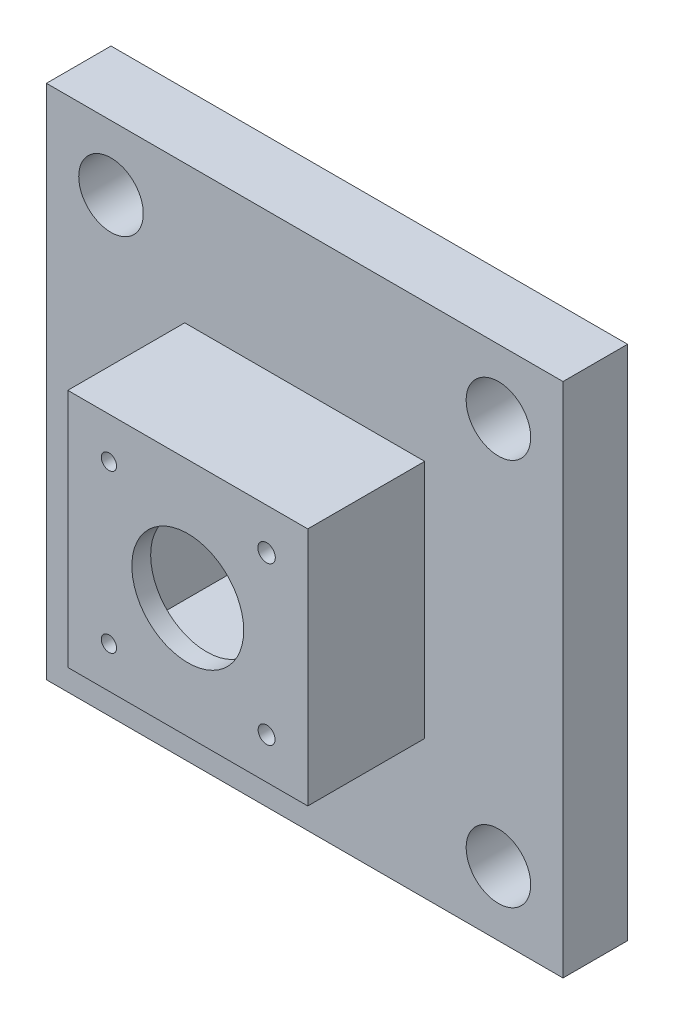
ISO-10303-21;
HEADER;
FILE_DESCRIPTION(('STEP AP214'),'2;1');
FILE_NAME('part.step','',(''),(''),'','','');
FILE_SCHEMA(('AUTOMOTIVE_DESIGN { 1 0 10303 214 1 1 1 1 }'));
ENDSEC;
DATA;
#1=APPLICATION_CONTEXT('core data for automotive mechanical design processes');
#2=APPLICATION_PROTOCOL_DEFINITION('international standard','automotive_design',2000,#1);
#3=PRODUCT_CONTEXT('',#1,'mechanical');
#4=PRODUCT('Part','Part','',(#3));
#5=PRODUCT_RELATED_PRODUCT_CATEGORY('part','',(#4));
#6=PRODUCT_DEFINITION_FORMATION('','',#4);
#7=PRODUCT_DEFINITION_CONTEXT('part definition',#1,'design');
#8=PRODUCT_DEFINITION('design','',#6,#7);
#9=PRODUCT_DEFINITION_SHAPE('','',#8);
#10=(LENGTH_UNIT() NAMED_UNIT(*) SI_UNIT(.MILLI.,.METRE.));
#11=(NAMED_UNIT(*) PLANE_ANGLE_UNIT() SI_UNIT($,.RADIAN.));
#12=(NAMED_UNIT(*) SI_UNIT($,.STERADIAN.) SOLID_ANGLE_UNIT());
#13=UNCERTAINTY_MEASURE_WITH_UNIT(LENGTH_MEASURE(1.E-05),#10,'distance_accuracy_value','');
#14=(GEOMETRIC_REPRESENTATION_CONTEXT(3) GLOBAL_UNCERTAINTY_ASSIGNED_CONTEXT((#13)) GLOBAL_UNIT_ASSIGNED_CONTEXT((#10,
#11,#12)) REPRESENTATION_CONTEXT('',''));
#15=CARTESIAN_POINT('',(0.,0.,0.));
#16=DIRECTION('',(0.,0.,1.));
#17=DIRECTION('',(1.,0.,0.));
#18=AXIS2_PLACEMENT_3D('',#15,#16,#17);
#19=CARTESIAN_POINT('',(0.,0.,12.7));
#20=DIRECTION('',(0.,0.,-1.));
#21=DIRECTION('',(-1.,0.,0.));
#22=AXIS2_PLACEMENT_3D('',#19,#20,#21);
#23=PLANE('',#22);
#24=DIRECTION('',(-1.,0.,0.));
#25=VECTOR('',#24,1.);
#26=CARTESIAN_POINT('',(32.2,55.8,12.7));
#27=LINE('',#26,#25);
#28=CARTESIAN_POINT('',(29.3,55.8,12.7));
#29=VERTEX_POINT('',#28);
#30=CARTESIAN_POINT('',(27.2,55.8,12.7));
#31=VERTEX_POINT('',#30);
#32=EDGE_CURVE('E216',#29,#31,#27,.T.);
#33=ORIENTED_EDGE('',*,*,#32,.T.);
#34=DIRECTION('',(0.,1.,0.));
#35=VECTOR('',#34,1.);
#36=CARTESIAN_POINT('',(27.2,55.8,12.7));
#37=LINE('',#36,#35);
#38=CARTESIAN_POINT('',(27.2,45.8,12.7));
#39=VERTEX_POINT('',#38);
#40=EDGE_CURVE('E170',#39,#31,#37,.T.);
#41=ORIENTED_EDGE('',*,*,#40,.F.);
#42=DIRECTION('',(-1.,0.,0.));
#43=VECTOR('',#42,1.);
#44=CARTESIAN_POINT('',(32.2,45.8,12.7));
#45=LINE('',#44,#43);
#46=CARTESIAN_POINT('',(29.3,45.8,12.7));
#47=VERTEX_POINT('',#46);
#48=EDGE_CURVE('E215',#47,#39,#45,.T.);
#49=ORIENTED_EDGE('',*,*,#48,.F.);
#50=DIRECTION('',(0.,-1.,0.));
#51=VECTOR('',#50,1.);
#52=CARTESIAN_POINT('',(29.3,29.3,12.7));
#53=LINE('',#52,#51);
#54=EDGE_CURVE('E11',#29,#47,#53,.T.);
#55=ORIENTED_EDGE('',*,*,#54,.F.);
#56=EDGE_LOOP('',(#33,#41,#49,#55));
#57=FACE_BOUND('',#56,.T.);
#58=ADVANCED_FACE('F32',(#57),#23,.F.);
#59=CARTESIAN_POINT('',(12.7,88.9,12.7));
#60=DIRECTION('',(0.,0.,-1.));
#61=DIRECTION('',(-1.,0.,0.));
#62=AXIS2_PLACEMENT_3D('',#59,#60,#61);
#63=CIRCLE('',#62,6.35);
#64=CARTESIAN_POINT('',(6.35,88.9,12.7));
#65=VERTEX_POINT('',#64);
#66=EDGE_CURVE('E747',#65,#65,#63,.T.);
#67=ORIENTED_EDGE('',*,*,#66,.T.);
#68=EDGE_LOOP('',(#67));
#69=FACE_BOUND('',#68,.T.);
#70=CARTESIAN_POINT('',(88.9,12.7,12.7));
#71=DIRECTION('',(0.,0.,-1.));
#72=DIRECTION('',(-1.,0.,0.));
#73=AXIS2_PLACEMENT_3D('',#70,#71,#72);
#74=CIRCLE('',#73,6.35);
#75=CARTESIAN_POINT('',(82.55,12.7,12.7));
#76=VERTEX_POINT('',#75);
#77=EDGE_CURVE('E751',#76,#76,#74,.T.);
#78=ORIENTED_EDGE('',*,*,#77,.T.);
#79=EDGE_LOOP('',(#78));
#80=FACE_BOUND('',#79,.T.);
#81=CARTESIAN_POINT('',(12.7,12.7,12.7));
#82=DIRECTION('',(0.,0.,-1.));
#83=DIRECTION('',(-1.,0.,0.));
#84=AXIS2_PLACEMENT_3D('',#81,#82,#83);
#85=CIRCLE('',#84,6.35);
#86=CARTESIAN_POINT('',(6.35,12.7,12.7));
#87=VERTEX_POINT('',#86);
#88=EDGE_CURVE('E760',#87,#87,#85,.T.);
#89=ORIENTED_EDGE('',*,*,#88,.T.);
#90=EDGE_LOOP('',(#89));
#91=FACE_BOUND('',#90,.T.);
#92=CARTESIAN_POINT('',(88.9,88.9,12.7));
#93=DIRECTION('',(0.,0.,-1.));
#94=DIRECTION('',(-1.,0.,0.));
#95=AXIS2_PLACEMENT_3D('',#92,#93,#94);
#96=CIRCLE('',#95,6.34999999999999);
#97=CARTESIAN_POINT('',(82.55,88.9,12.7));
#98=VERTEX_POINT('',#97);
#99=EDGE_CURVE('E198',#98,#98,#96,.T.);
#100=ORIENTED_EDGE('',*,*,#99,.T.);
#101=EDGE_LOOP('',(#100));
#102=FACE_BOUND('',#101,.T.);
#103=DIRECTION('',(0.,-1.,0.));
#104=VECTOR('',#103,1.);
#105=CARTESIAN_POINT('',(0.,0.,12.7));
#106=LINE('',#105,#104);
#107=CARTESIAN_POINT('',(0.,101.6,12.7));
#108=VERTEX_POINT('',#107);
#109=CARTESIAN_POINT('',(0.,0.,12.7));
#110=VERTEX_POINT('',#109);
#111=EDGE_CURVE('E308',#108,#110,#106,.T.);
#112=ORIENTED_EDGE('',*,*,#111,.T.);
#113=DIRECTION('',(1.,0.,0.));
#114=VECTOR('',#113,1.);
#115=CARTESIAN_POINT('',(0.,0.,12.7));
#116=LINE('',#115,#114);
#117=CARTESIAN_POINT('',(101.6,0.,12.7));
#118=VERTEX_POINT('',#117);
#119=EDGE_CURVE('E311',#110,#118,#116,.T.);
#120=ORIENTED_EDGE('',*,*,#119,.T.);
#121=DIRECTION('',(0.,1.,0.));
#122=VECTOR('',#121,1.);
#123=CARTESIAN_POINT('',(101.6,0.,12.7));
#124=LINE('',#123,#122);
#125=CARTESIAN_POINT('',(101.6,101.6,12.7));
#126=VERTEX_POINT('',#125);
#127=EDGE_CURVE('E314',#118,#126,#124,.T.);
#128=ORIENTED_EDGE('',*,*,#127,.T.);
#129=DIRECTION('',(-1.,0.,0.));
#130=VECTOR('',#129,1.);
#131=CARTESIAN_POINT('',(0.,101.6,12.7));
#132=LINE('',#131,#130);
#133=EDGE_CURVE('E316',#126,#108,#132,.T.);
#134=ORIENTED_EDGE('',*,*,#133,.T.);
#135=EDGE_LOOP('',(#112,#120,#128,#134));
#136=FACE_BOUND('',#135,.T.);
#137=DIRECTION('',(0.,-1.,0.));
#138=VECTOR('',#137,1.);
#139=CARTESIAN_POINT('',(27.2,27.2,12.7));
#140=LINE('',#139,#138);
#141=CARTESIAN_POINT('',(27.2,27.2,12.7));
#142=VERTEX_POINT('',#141);
#143=EDGE_CURVE('E267',#39,#142,#140,.T.);
#144=ORIENTED_EDGE('',*,*,#143,.F.);
#145=DIRECTION('',(1.,0.,0.));
#146=VECTOR('',#145,1.);
#147=CARTESIAN_POINT('',(27.2,45.8,12.7));
#148=LINE('',#147,#146);
#149=CARTESIAN_POINT('',(21.9,45.8,12.7));
#150=VERTEX_POINT('',#149);
#151=EDGE_CURVE('E185',#150,#39,#148,.T.);
#152=ORIENTED_EDGE('',*,*,#151,.F.);
#153=DIRECTION('',(0.,-1.,0.));
#154=VECTOR('',#153,1.);
#155=CARTESIAN_POINT('',(21.9,55.8,12.7));
#156=LINE('',#155,#154);
#157=CARTESIAN_POINT('',(21.9,55.8,12.7));
#158=VERTEX_POINT('',#157);
#159=EDGE_CURVE('E188',#158,#150,#156,.T.);
#160=ORIENTED_EDGE('',*,*,#159,.F.);
#161=DIRECTION('',(-1.,0.,0.));
#162=VECTOR('',#161,1.);
#163=CARTESIAN_POINT('',(27.2,55.8,12.7));
#164=LINE('',#163,#162);
#165=EDGE_CURVE('E197',#31,#158,#164,.T.);
#166=ORIENTED_EDGE('',*,*,#165,.F.);
#167=CARTESIAN_POINT('',(27.2,74.4,12.7));
#168=VERTEX_POINT('',#167);
#169=EDGE_CURVE('E285',#168,#31,#140,.T.);
#170=ORIENTED_EDGE('',*,*,#169,.F.);
#171=DIRECTION('',(-1.,0.,0.));
#172=VECTOR('',#171,1.);
#173=CARTESIAN_POINT('',(27.2,74.4,12.7));
#174=LINE('',#173,#172);
#175=CARTESIAN_POINT('',(74.4,74.4,12.7));
#176=VERTEX_POINT('',#175);
#177=EDGE_CURVE('E278',#176,#168,#174,.T.);
#178=ORIENTED_EDGE('',*,*,#177,.F.);
#179=DIRECTION('',(0.,1.,0.));
#180=VECTOR('',#179,1.);
#181=CARTESIAN_POINT('',(74.4,27.2,12.7));
#182=LINE('',#181,#180);
#183=CARTESIAN_POINT('',(74.4,27.2,12.7));
#184=VERTEX_POINT('',#183);
#185=EDGE_CURVE('E291',#184,#176,#182,.T.);
#186=ORIENTED_EDGE('',*,*,#185,.F.);
#187=DIRECTION('',(1.,0.,0.));
#188=VECTOR('',#187,1.);
#189=CARTESIAN_POINT('',(27.2,27.2,12.7));
#190=LINE('',#189,#188);
#191=EDGE_CURVE('E288',#142,#184,#190,.T.);
#192=ORIENTED_EDGE('',*,*,#191,.F.);
#193=EDGE_LOOP('',(#144,#152,#160,#166,#170,#178,#186,#192));
#194=FACE_BOUND('',#193,.T.);
#195=ADVANCED_FACE('F374',(#69,#80,#91,#102,#136,#194),#23,.F.);
#196=CARTESIAN_POINT('',(0.,0.,12.7));
#197=DIRECTION('',(1.,0.,0.));
#198=DIRECTION('',(0.,0.,-1.));
#199=AXIS2_PLACEMENT_3D('',#196,#197,#198);
#200=PLANE('',#199);
#201=DIRECTION('',(0.,-1.,0.));
#202=VECTOR('',#201,1.);
#203=CARTESIAN_POINT('',(0.,0.,0.));
#204=LINE('',#203,#202);
#205=CARTESIAN_POINT('',(0.,101.6,0.));
#206=VERTEX_POINT('',#205);
#207=CARTESIAN_POINT('',(0.,0.,0.));
#208=VERTEX_POINT('',#207);
#209=EDGE_CURVE('E307',#206,#208,#204,.T.);
#210=ORIENTED_EDGE('',*,*,#209,.T.);
#211=DIRECTION('',(0.,0.,-1.));
#212=VECTOR('',#211,1.);
#213=CARTESIAN_POINT('',(0.,0.,12.7));
#214=LINE('',#213,#212);
#215=EDGE_CURVE('E334',#110,#208,#214,.T.);
#216=ORIENTED_EDGE('',*,*,#215,.F.);
#217=ORIENTED_EDGE('',*,*,#111,.F.);
#218=DIRECTION('',(0.,0.,-1.));
#219=VECTOR('',#218,1.);
#220=CARTESIAN_POINT('',(0.,101.6,12.7));
#221=LINE('',#220,#219);
#222=EDGE_CURVE('E318',#108,#206,#221,.T.);
#223=ORIENTED_EDGE('',*,*,#222,.T.);
#224=EDGE_LOOP('',(#210,#216,#217,#223));
#225=FACE_BOUND('',#224,.T.);
#226=ADVANCED_FACE('F34',(#225),#200,.F.);
#227=CARTESIAN_POINT('',(0.,0.,12.7));
#228=DIRECTION('',(0.,1.,0.));
#229=DIRECTION('',(0.,0.,1.));
#230=AXIS2_PLACEMENT_3D('',#227,#228,#229);
#231=PLANE('',#230);
#232=DIRECTION('',(1.,0.,0.));
#233=VECTOR('',#232,1.);
#234=CARTESIAN_POINT('',(0.,0.,0.));
#235=LINE('',#234,#233);
#236=CARTESIAN_POINT('',(101.6,0.,0.));
#237=VERTEX_POINT('',#236);
#238=EDGE_CURVE('E321',#208,#237,#235,.T.);
#239=ORIENTED_EDGE('',*,*,#238,.T.);
#240=DIRECTION('',(0.,0.,-1.));
#241=VECTOR('',#240,1.);
#242=CARTESIAN_POINT('',(101.6,0.,12.7));
#243=LINE('',#242,#241);
#244=EDGE_CURVE('E331',#118,#237,#243,.T.);
#245=ORIENTED_EDGE('',*,*,#244,.F.);
#246=ORIENTED_EDGE('',*,*,#119,.F.);
#247=ORIENTED_EDGE('',*,*,#215,.T.);
#248=EDGE_LOOP('',(#239,#245,#246,#247));
#249=FACE_BOUND('',#248,.T.);
#250=ADVANCED_FACE('F421',(#249),#231,.F.);
#251=CARTESIAN_POINT('',(101.6,0.,12.7));
#252=DIRECTION('',(-1.,0.,0.));
#253=DIRECTION('',(0.,0.,1.));
#254=AXIS2_PLACEMENT_3D('',#251,#252,#253);
#255=PLANE('',#254);
#256=DIRECTION('',(0.,1.,0.));
#257=VECTOR('',#256,1.);
#258=CARTESIAN_POINT('',(101.6,0.,0.));
#259=LINE('',#258,#257);
#260=CARTESIAN_POINT('',(101.6,101.6,0.));
#261=VERTEX_POINT('',#260);
#262=EDGE_CURVE('E323',#237,#261,#259,.T.);
#263=ORIENTED_EDGE('',*,*,#262,.T.);
#264=DIRECTION('',(0.,0.,-1.));
#265=VECTOR('',#264,1.);
#266=CARTESIAN_POINT('',(101.6,101.6,12.7));
#267=LINE('',#266,#265);
#268=EDGE_CURVE('E328',#126,#261,#267,.T.);
#269=ORIENTED_EDGE('',*,*,#268,.F.);
#270=ORIENTED_EDGE('',*,*,#127,.F.);
#271=ORIENTED_EDGE('',*,*,#244,.T.);
#272=EDGE_LOOP('',(#263,#269,#270,#271));
#273=FACE_BOUND('',#272,.T.);
#274=ADVANCED_FACE('F418',(#273),#255,.F.);
#275=CARTESIAN_POINT('',(0.,101.6,12.7));
#276=DIRECTION('',(0.,-1.,0.));
#277=DIRECTION('',(0.,0.,-1.));
#278=AXIS2_PLACEMENT_3D('',#275,#276,#277);
#279=PLANE('',#278);
#280=DIRECTION('',(-1.,0.,0.));
#281=VECTOR('',#280,1.);
#282=CARTESIAN_POINT('',(0.,101.6,0.));
#283=LINE('',#282,#281);
#284=EDGE_CURVE('E312',#261,#206,#283,.T.);
#285=ORIENTED_EDGE('',*,*,#284,.T.);
#286=ORIENTED_EDGE('',*,*,#222,.F.);
#287=ORIENTED_EDGE('',*,*,#133,.F.);
#288=ORIENTED_EDGE('',*,*,#268,.T.);
#289=EDGE_LOOP('',(#285,#286,#287,#288));
#290=FACE_BOUND('',#289,.T.);
#291=ADVANCED_FACE('F414',(#290),#279,.F.);
#292=CARTESIAN_POINT('',(0.,0.,0.));
#293=DIRECTION('',(0.,0.,-1.));
#294=DIRECTION('',(-1.,0.,0.));
#295=AXIS2_PLACEMENT_3D('',#292,#293,#294);
#296=PLANE('',#295);
#297=CARTESIAN_POINT('',(12.7,88.9,0.));
#298=DIRECTION('',(0.,0.,-1.));
#299=DIRECTION('',(-1.,0.,0.));
#300=AXIS2_PLACEMENT_3D('',#297,#298,#299);
#301=CIRCLE('',#300,6.35);
#302=CARTESIAN_POINT('',(6.35,88.9,0.));
#303=VERTEX_POINT('',#302);
#304=EDGE_CURVE('E750',#303,#303,#301,.T.);
#305=ORIENTED_EDGE('',*,*,#304,.F.);
#306=EDGE_LOOP('',(#305));
#307=FACE_BOUND('',#306,.T.);
#308=CARTESIAN_POINT('',(88.9,12.7,0.));
#309=DIRECTION('',(0.,0.,-1.));
#310=DIRECTION('',(-1.,0.,0.));
#311=AXIS2_PLACEMENT_3D('',#308,#309,#310);
#312=CIRCLE('',#311,6.35);
#313=CARTESIAN_POINT('',(82.55,12.7,0.));
#314=VERTEX_POINT('',#313);
#315=EDGE_CURVE('E755',#314,#314,#312,.T.);
#316=ORIENTED_EDGE('',*,*,#315,.F.);
#317=EDGE_LOOP('',(#316));
#318=FACE_BOUND('',#317,.T.);
#319=CARTESIAN_POINT('',(12.7,12.7,0.));
#320=DIRECTION('',(0.,0.,-1.));
#321=DIRECTION('',(-1.,0.,0.));
#322=AXIS2_PLACEMENT_3D('',#319,#320,#321);
#323=CIRCLE('',#322,6.35);
#324=CARTESIAN_POINT('',(6.35,12.7,0.));
#325=VERTEX_POINT('',#324);
#326=EDGE_CURVE('E771',#325,#325,#323,.T.);
#327=ORIENTED_EDGE('',*,*,#326,.F.);
#328=EDGE_LOOP('',(#327));
#329=FACE_BOUND('',#328,.T.);
#330=CARTESIAN_POINT('',(88.9,88.9,0.));
#331=DIRECTION('',(0.,0.,-1.));
#332=DIRECTION('',(-1.,0.,0.));
#333=AXIS2_PLACEMENT_3D('',#330,#331,#332);
#334=CIRCLE('',#333,6.34999999999999);
#335=CARTESIAN_POINT('',(82.55,88.9,0.));
#336=VERTEX_POINT('',#335);
#337=EDGE_CURVE('E191',#336,#336,#334,.T.);
#338=ORIENTED_EDGE('',*,*,#337,.F.);
#339=EDGE_LOOP('',(#338));
#340=FACE_BOUND('',#339,.T.);
#341=DIRECTION('',(0.,1.,0.));
#342=VECTOR('',#341,1.);
#343=CARTESIAN_POINT('',(27.2,55.8,0.));
#344=LINE('',#343,#342);
#345=CARTESIAN_POINT('',(27.2,45.8,0.));
#346=VERTEX_POINT('',#345);
#347=CARTESIAN_POINT('',(27.2,55.8,0.));
#348=VERTEX_POINT('',#347);
#349=EDGE_CURVE('E167',#346,#348,#344,.T.);
#350=ORIENTED_EDGE('',*,*,#349,.T.);
#351=DIRECTION('',(-1.,0.,0.));
#352=VECTOR('',#351,1.);
#353=CARTESIAN_POINT('',(27.2,55.8,0.));
#354=LINE('',#353,#352);
#355=CARTESIAN_POINT('',(21.9,55.8,0.));
#356=VERTEX_POINT('',#355);
#357=EDGE_CURVE('E178',#348,#356,#354,.T.);
#358=ORIENTED_EDGE('',*,*,#357,.T.);
#359=DIRECTION('',(0.,-1.,0.));
#360=VECTOR('',#359,1.);
#361=CARTESIAN_POINT('',(21.9,55.8,0.));
#362=LINE('',#361,#360);
#363=CARTESIAN_POINT('',(21.9,45.8,0.));
#364=VERTEX_POINT('',#363);
#365=EDGE_CURVE('E47',#356,#364,#362,.T.);
#366=ORIENTED_EDGE('',*,*,#365,.T.);
#367=DIRECTION('',(1.,0.,0.));
#368=VECTOR('',#367,1.);
#369=CARTESIAN_POINT('',(27.2,45.8,0.));
#370=LINE('',#369,#368);
#371=EDGE_CURVE('E175',#364,#346,#370,.T.);
#372=ORIENTED_EDGE('',*,*,#371,.T.);
#373=EDGE_LOOP('',(#350,#358,#366,#372));
#374=FACE_BOUND('',#373,.T.);
#375=DIRECTION('',(0.,1.,0.));
#376=VECTOR('',#375,1.);
#377=CARTESIAN_POINT('',(29.3,29.3,0.));
#378=LINE('',#377,#376);
#379=CARTESIAN_POINT('',(29.3,29.3,0.));
#380=VERTEX_POINT('',#379);
#381=CARTESIAN_POINT('',(29.3,71.6,0.));
#382=VERTEX_POINT('',#381);
#383=EDGE_CURVE('E254',#380,#382,#378,.T.);
#384=ORIENTED_EDGE('',*,*,#383,.F.);
#385=DIRECTION('',(-1.,0.,0.));
#386=VECTOR('',#385,1.);
#387=CARTESIAN_POINT('',(29.3,29.3,0.));
#388=LINE('',#387,#386);
#389=CARTESIAN_POINT('',(71.6,29.3,0.));
#390=VERTEX_POINT('',#389);
#391=EDGE_CURVE('E244',#390,#380,#388,.T.);
#392=ORIENTED_EDGE('',*,*,#391,.F.);
#393=DIRECTION('',(0.,-1.,0.));
#394=VECTOR('',#393,1.);
#395=CARTESIAN_POINT('',(71.6,29.3,0.));
#396=LINE('',#395,#394);
#397=CARTESIAN_POINT('',(71.6,71.6,0.));
#398=VERTEX_POINT('',#397);
#399=EDGE_CURVE('E260',#398,#390,#396,.T.);
#400=ORIENTED_EDGE('',*,*,#399,.F.);
#401=DIRECTION('',(1.,0.,0.));
#402=VECTOR('',#401,1.);
#403=CARTESIAN_POINT('',(29.3,71.6,0.));
#404=LINE('',#403,#402);
#405=EDGE_CURVE('E256',#382,#398,#404,.T.);
#406=ORIENTED_EDGE('',*,*,#405,.F.);
#407=EDGE_LOOP('',(#384,#392,#400,#406));
#408=FACE_BOUND('',#407,.T.);
#409=ORIENTED_EDGE('',*,*,#209,.F.);
#410=ORIENTED_EDGE('',*,*,#284,.F.);
#411=ORIENTED_EDGE('',*,*,#262,.F.);
#412=ORIENTED_EDGE('',*,*,#238,.F.);
#413=EDGE_LOOP('',(#409,#410,#411,#412));
#414=FACE_BOUND('',#413,.T.);
#415=ADVANCED_FACE('F182',(#307,#318,#329,#340,#374,#408,#414),#296,.T.);
#416=CARTESIAN_POINT('',(27.2,27.2,35.7));
#417=DIRECTION('',(1.,0.,0.));
#418=DIRECTION('',(0.,0.,-1.));
#419=AXIS2_PLACEMENT_3D('',#416,#417,#418);
#420=PLANE('',#419);
#421=ORIENTED_EDGE('',*,*,#169,.T.);
#422=DIRECTION('',(0.,0.,-1.));
#423=VECTOR('',#422,1.);
#424=CARTESIAN_POINT('',(27.2,55.8,12.7));
#425=LINE('',#424,#423);
#426=CARTESIAN_POINT('',(27.2,55.8,18.));
#427=VERTEX_POINT('',#426);
#428=EDGE_CURVE('E212',#427,#31,#425,.T.);
#429=ORIENTED_EDGE('',*,*,#428,.F.);
#430=DIRECTION('',(0.,1.,0.));
#431=VECTOR('',#430,1.);
#432=CARTESIAN_POINT('',(27.2,45.8,18.));
#433=LINE('',#432,#431);
#434=CARTESIAN_POINT('',(27.2,45.8,18.));
#435=VERTEX_POINT('',#434);
#436=EDGE_CURVE('E209',#435,#427,#433,.T.);
#437=ORIENTED_EDGE('',*,*,#436,.F.);
#438=DIRECTION('',(0.,0.,1.));
#439=VECTOR('',#438,1.);
#440=CARTESIAN_POINT('',(27.2,45.8,12.7));
#441=LINE('',#440,#439);
#442=EDGE_CURVE('E204',#39,#435,#441,.T.);
#443=ORIENTED_EDGE('',*,*,#442,.F.);
#444=ORIENTED_EDGE('',*,*,#143,.T.);
#445=DIRECTION('',(0.,0.,-1.));
#446=VECTOR('',#445,1.);
#447=CARTESIAN_POINT('',(27.2,27.2,35.7));
#448=LINE('',#447,#446);
#449=CARTESIAN_POINT('',(27.2,27.2,35.7));
#450=VERTEX_POINT('',#449);
#451=EDGE_CURVE('E304',#450,#142,#448,.T.);
#452=ORIENTED_EDGE('',*,*,#451,.F.);
#453=DIRECTION('',(0.,-1.,0.));
#454=VECTOR('',#453,1.);
#455=CARTESIAN_POINT('',(27.2,27.2,35.7));
#456=LINE('',#455,#454);
#457=CARTESIAN_POINT('',(27.2,74.4,35.7));
#458=VERTEX_POINT('',#457);
#459=EDGE_CURVE('E274',#458,#450,#456,.T.);
#460=ORIENTED_EDGE('',*,*,#459,.F.);
#461=DIRECTION('',(0.,0.,-1.));
#462=VECTOR('',#461,1.);
#463=CARTESIAN_POINT('',(27.2,74.4,35.7));
#464=LINE('',#463,#462);
#465=EDGE_CURVE('E284',#458,#168,#464,.T.);
#466=ORIENTED_EDGE('',*,*,#465,.T.);
#467=EDGE_LOOP('',(#421,#429,#437,#443,#444,#452,#460,#466));
#468=FACE_BOUND('',#467,.T.);
#469=ADVANCED_FACE('F369',(#468),#420,.F.);
#470=CARTESIAN_POINT('',(27.2,27.2,35.7));
#471=DIRECTION('',(0.,1.,0.));
#472=DIRECTION('',(0.,0.,1.));
#473=AXIS2_PLACEMENT_3D('',#470,#471,#472);
#474=PLANE('',#473);
#475=ORIENTED_EDGE('',*,*,#191,.T.);
#476=DIRECTION('',(0.,0.,-1.));
#477=VECTOR('',#476,1.);
#478=CARTESIAN_POINT('',(74.4,27.2,35.7));
#479=LINE('',#478,#477);
#480=CARTESIAN_POINT('',(74.4,27.2,35.7));
#481=VERTEX_POINT('',#480);
#482=EDGE_CURVE('E301',#481,#184,#479,.T.);
#483=ORIENTED_EDGE('',*,*,#482,.F.);
#484=DIRECTION('',(1.,0.,0.));
#485=VECTOR('',#484,1.);
#486=CARTESIAN_POINT('',(27.2,27.2,35.7));
#487=LINE('',#486,#485);
#488=EDGE_CURVE('E277',#450,#481,#487,.T.);
#489=ORIENTED_EDGE('',*,*,#488,.F.);
#490=ORIENTED_EDGE('',*,*,#451,.T.);
#491=EDGE_LOOP('',(#475,#483,#489,#490));
#492=FACE_BOUND('',#491,.T.);
#493=ADVANCED_FACE('F386',(#492),#474,.F.);
#494=CARTESIAN_POINT('',(74.4,27.2,35.7));
#495=DIRECTION('',(-1.,0.,0.));
#496=DIRECTION('',(0.,0.,1.));
#497=AXIS2_PLACEMENT_3D('',#494,#495,#496);
#498=PLANE('',#497);
#499=ORIENTED_EDGE('',*,*,#185,.T.);
#500=DIRECTION('',(0.,0.,-1.));
#501=VECTOR('',#500,1.);
#502=CARTESIAN_POINT('',(74.4,74.4,35.7));
#503=LINE('',#502,#501);
#504=CARTESIAN_POINT('',(74.4,74.4,35.7));
#505=VERTEX_POINT('',#504);
#506=EDGE_CURVE('E298',#505,#176,#503,.T.);
#507=ORIENTED_EDGE('',*,*,#506,.F.);
#508=DIRECTION('',(0.,1.,0.));
#509=VECTOR('',#508,1.);
#510=CARTESIAN_POINT('',(74.4,27.2,35.7));
#511=LINE('',#510,#509);
#512=EDGE_CURVE('E280',#481,#505,#511,.T.);
#513=ORIENTED_EDGE('',*,*,#512,.F.);
#514=ORIENTED_EDGE('',*,*,#482,.T.);
#515=EDGE_LOOP('',(#499,#507,#513,#514));
#516=FACE_BOUND('',#515,.T.);
#517=ADVANCED_FACE('F382',(#516),#498,.F.);
#518=CARTESIAN_POINT('',(27.2,74.4,35.7));
#519=DIRECTION('',(0.,-1.,0.));
#520=DIRECTION('',(0.,0.,-1.));
#521=AXIS2_PLACEMENT_3D('',#518,#519,#520);
#522=PLANE('',#521);
#523=ORIENTED_EDGE('',*,*,#177,.T.);
#524=ORIENTED_EDGE('',*,*,#465,.F.);
#525=DIRECTION('',(-1.,0.,0.));
#526=VECTOR('',#525,1.);
#527=CARTESIAN_POINT('',(27.2,74.4,35.7));
#528=LINE('',#527,#526);
#529=EDGE_CURVE('E282',#505,#458,#528,.T.);
#530=ORIENTED_EDGE('',*,*,#529,.F.);
#531=ORIENTED_EDGE('',*,*,#506,.T.);
#532=EDGE_LOOP('',(#523,#524,#530,#531));
#533=FACE_BOUND('',#532,.T.);
#534=ADVANCED_FACE('F377',(#533),#522,.F.);
#535=CARTESIAN_POINT('',(0.,0.,35.7));
#536=DIRECTION('',(0.,0.,-1.));
#537=DIRECTION('',(-1.,0.,0.));
#538=AXIS2_PLACEMENT_3D('',#535,#536,#537);
#539=PLANE('',#538);
#540=CARTESIAN_POINT('',(35.3,35.3,35.7));
#541=DIRECTION('',(0.,0.,1.));
#542=DIRECTION('',(1.,0.,0.));
#543=AXIS2_PLACEMENT_3D('',#540,#541,#542);
#544=CIRCLE('',#543,1.5);
#545=CARTESIAN_POINT('',(36.8,35.3,35.7));
#546=VERTEX_POINT('',#545);
#547=EDGE_CURVE('E219',#546,#546,#544,.T.);
#548=ORIENTED_EDGE('',*,*,#547,.F.);
#549=EDGE_LOOP('',(#548));
#550=FACE_BOUND('',#549,.T.);
#551=CARTESIAN_POINT('',(66.3,35.3,35.7));
#552=DIRECTION('',(0.,0.,1.));
#553=DIRECTION('',(1.,0.,0.));
#554=AXIS2_PLACEMENT_3D('',#551,#552,#553);
#555=CIRCLE('',#554,1.66151880864069);
#556=CARTESIAN_POINT('',(67.9615188086407,35.3,35.7));
#557=VERTEX_POINT('',#556);
#558=EDGE_CURVE('E232',#557,#557,#555,.T.);
#559=ORIENTED_EDGE('',*,*,#558,.F.);
#560=EDGE_LOOP('',(#559));
#561=FACE_BOUND('',#560,.T.);
#562=CARTESIAN_POINT('',(66.3,66.3,35.7));
#563=DIRECTION('',(0.,0.,1.));
#564=DIRECTION('',(1.,0.,0.));
#565=AXIS2_PLACEMENT_3D('',#562,#563,#564);
#566=CIRCLE('',#565,1.71520678515516);
#567=CARTESIAN_POINT('',(68.0152067851552,66.3,35.7));
#568=VERTEX_POINT('',#567);
#569=EDGE_CURVE('E229',#568,#568,#566,.T.);
#570=ORIENTED_EDGE('',*,*,#569,.F.);
#571=EDGE_LOOP('',(#570));
#572=FACE_BOUND('',#571,.T.);
#573=CARTESIAN_POINT('',(35.3,66.3,35.7));
#574=DIRECTION('',(0.,0.,1.));
#575=DIRECTION('',(1.,0.,0.));
#576=AXIS2_PLACEMENT_3D('',#573,#574,#575);
#577=CIRCLE('',#576,1.5);
#578=CARTESIAN_POINT('',(36.8,66.3,35.7));
#579=VERTEX_POINT('',#578);
#580=EDGE_CURVE('E225',#579,#579,#577,.T.);
#581=ORIENTED_EDGE('',*,*,#580,.F.);
#582=EDGE_LOOP('',(#581));
#583=FACE_BOUND('',#582,.T.);
#584=CARTESIAN_POINT('',(50.8,50.8,35.7));
#585=DIRECTION('',(0.,0.,1.));
#586=DIRECTION('',(1.,0.,0.));
#587=AXIS2_PLACEMENT_3D('',#584,#585,#586);
#588=CIRCLE('',#587,11.);
#589=CARTESIAN_POINT('',(61.8,50.8,35.7));
#590=VERTEX_POINT('',#589);
#591=EDGE_CURVE('E228',#590,#590,#588,.T.);
#592=ORIENTED_EDGE('',*,*,#591,.F.);
#593=EDGE_LOOP('',(#592));
#594=FACE_BOUND('',#593,.T.);
#595=ORIENTED_EDGE('',*,*,#459,.T.);
#596=ORIENTED_EDGE('',*,*,#488,.T.);
#597=ORIENTED_EDGE('',*,*,#512,.T.);
#598=ORIENTED_EDGE('',*,*,#529,.T.);
#599=EDGE_LOOP('',(#595,#596,#597,#598));
#600=FACE_BOUND('',#599,.T.);
#601=ADVANCED_FACE('F556',(#550,#561,#572,#583,#594,#600),#539,.F.);
#602=CARTESIAN_POINT('',(29.3,29.3,32.));
#603=DIRECTION('',(-1.,0.,0.));
#604=DIRECTION('',(0.,0.,1.));
#605=AXIS2_PLACEMENT_3D('',#602,#603,#604);
#606=PLANE('',#605);
#607=DIRECTION('',(0.,0.,-1.));
#608=VECTOR('',#607,1.);
#609=CARTESIAN_POINT('',(29.3,55.8,32.));
#610=LINE('',#609,#608);
#611=CARTESIAN_POINT('',(29.3,55.8,18.));
#612=VERTEX_POINT('',#611);
#613=EDGE_CURVE('E40',#612,#29,#610,.T.);
#614=ORIENTED_EDGE('',*,*,#613,.T.);
#615=ORIENTED_EDGE('',*,*,#54,.T.);
#616=DIRECTION('',(0.,0.,1.));
#617=VECTOR('',#616,1.);
#618=CARTESIAN_POINT('',(29.3,45.8,32.));
#619=LINE('',#618,#617);
#620=CARTESIAN_POINT('',(29.3,45.8,18.));
#621=VERTEX_POINT('',#620);
#622=EDGE_CURVE('E337',#47,#621,#619,.T.);
#623=ORIENTED_EDGE('',*,*,#622,.T.);
#624=DIRECTION('',(0.,1.,0.));
#625=VECTOR('',#624,1.);
#626=CARTESIAN_POINT('',(29.3,29.3,18.));
#627=LINE('',#626,#625);
#628=EDGE_CURVE('E353',#621,#612,#627,.T.);
#629=ORIENTED_EDGE('',*,*,#628,.T.);
#630=EDGE_LOOP('',(#614,#615,#623,#629));
#631=FACE_BOUND('',#630,.T.);
#632=ORIENTED_EDGE('',*,*,#383,.T.);
#633=DIRECTION('',(0.,0.,-1.));
#634=VECTOR('',#633,1.);
#635=CARTESIAN_POINT('',(29.3,71.6,32.));
#636=LINE('',#635,#634);
#637=CARTESIAN_POINT('',(29.3,71.6,32.));
#638=VERTEX_POINT('',#637);
#639=EDGE_CURVE('E253',#638,#382,#636,.T.);
#640=ORIENTED_EDGE('',*,*,#639,.F.);
#641=DIRECTION('',(0.,1.,0.));
#642=VECTOR('',#641,1.);
#643=CARTESIAN_POINT('',(29.3,29.3,32.));
#644=LINE('',#643,#642);
#645=CARTESIAN_POINT('',(29.3,29.3,32.));
#646=VERTEX_POINT('',#645);
#647=EDGE_CURVE('E240',#646,#638,#644,.T.);
#648=ORIENTED_EDGE('',*,*,#647,.F.);
#649=DIRECTION('',(0.,0.,-1.));
#650=VECTOR('',#649,1.);
#651=CARTESIAN_POINT('',(29.3,29.3,32.));
#652=LINE('',#651,#650);
#653=EDGE_CURVE('E265',#646,#380,#652,.T.);
#654=ORIENTED_EDGE('',*,*,#653,.T.);
#655=EDGE_LOOP('',(#632,#640,#648,#654));
#656=FACE_BOUND('',#655,.T.);
#657=ADVANCED_FACE('F357',(#631,#656),#606,.F.);
#658=CARTESIAN_POINT('',(29.3,29.3,32.));
#659=DIRECTION('',(0.,-1.,0.));
#660=DIRECTION('',(0.,0.,-1.));
#661=AXIS2_PLACEMENT_3D('',#658,#659,#660);
#662=PLANE('',#661);
#663=ORIENTED_EDGE('',*,*,#391,.T.);
#664=ORIENTED_EDGE('',*,*,#653,.F.);
#665=DIRECTION('',(-1.,0.,0.));
#666=VECTOR('',#665,1.);
#667=CARTESIAN_POINT('',(29.3,29.3,32.));
#668=LINE('',#667,#666);
#669=CARTESIAN_POINT('',(71.6,29.3,32.));
#670=VERTEX_POINT('',#669);
#671=EDGE_CURVE('E250',#670,#646,#668,.T.);
#672=ORIENTED_EDGE('',*,*,#671,.F.);
#673=DIRECTION('',(0.,0.,-1.));
#674=VECTOR('',#673,1.);
#675=CARTESIAN_POINT('',(71.6,29.3,32.));
#676=LINE('',#675,#674);
#677=EDGE_CURVE('E268',#670,#390,#676,.T.);
#678=ORIENTED_EDGE('',*,*,#677,.T.);
#679=EDGE_LOOP('',(#663,#664,#672,#678));
#680=FACE_BOUND('',#679,.T.);
#681=ADVANCED_FACE('F543',(#680),#662,.F.);
#682=CARTESIAN_POINT('',(71.6,29.3,32.));
#683=DIRECTION('',(1.,0.,0.));
#684=DIRECTION('',(0.,0.,-1.));
#685=AXIS2_PLACEMENT_3D('',#682,#683,#684);
#686=PLANE('',#685);
#687=ORIENTED_EDGE('',*,*,#399,.T.);
#688=ORIENTED_EDGE('',*,*,#677,.F.);
#689=DIRECTION('',(0.,-1.,0.));
#690=VECTOR('',#689,1.);
#691=CARTESIAN_POINT('',(71.6,29.3,32.));
#692=LINE('',#691,#690);
#693=CARTESIAN_POINT('',(71.6,71.6,32.));
#694=VERTEX_POINT('',#693);
#695=EDGE_CURVE('E247',#694,#670,#692,.T.);
#696=ORIENTED_EDGE('',*,*,#695,.F.);
#697=DIRECTION('',(0.,0.,-1.));
#698=VECTOR('',#697,1.);
#699=CARTESIAN_POINT('',(71.6,71.6,32.));
#700=LINE('',#699,#698);
#701=EDGE_CURVE('E270',#694,#398,#700,.T.);
#702=ORIENTED_EDGE('',*,*,#701,.T.);
#703=EDGE_LOOP('',(#687,#688,#696,#702));
#704=FACE_BOUND('',#703,.T.);
#705=ADVANCED_FACE('F546',(#704),#686,.F.);
#706=CARTESIAN_POINT('',(29.3,71.6,32.));
#707=DIRECTION('',(0.,1.,0.));
#708=DIRECTION('',(0.,0.,1.));
#709=AXIS2_PLACEMENT_3D('',#706,#707,#708);
#710=PLANE('',#709);
#711=ORIENTED_EDGE('',*,*,#405,.T.);
#712=ORIENTED_EDGE('',*,*,#701,.F.);
#713=DIRECTION('',(1.,0.,0.));
#714=VECTOR('',#713,1.);
#715=CARTESIAN_POINT('',(29.3,71.6,32.));
#716=LINE('',#715,#714);
#717=EDGE_CURVE('E243',#638,#694,#716,.T.);
#718=ORIENTED_EDGE('',*,*,#717,.F.);
#719=ORIENTED_EDGE('',*,*,#639,.T.);
#720=EDGE_LOOP('',(#711,#712,#718,#719));
#721=FACE_BOUND('',#720,.T.);
#722=ADVANCED_FACE('F541',(#721),#710,.F.);
#723=CARTESIAN_POINT('',(0.,0.,32.));
#724=DIRECTION('',(0.,0.,-1.));
#725=DIRECTION('',(-1.,0.,0.));
#726=AXIS2_PLACEMENT_3D('',#723,#724,#725);
#727=PLANE('',#726);
#728=CARTESIAN_POINT('',(35.3,35.3,32.));
#729=DIRECTION('',(0.,0.,-1.));
#730=DIRECTION('',(-1.,0.,0.));
#731=AXIS2_PLACEMENT_3D('',#728,#729,#730);
#732=CIRCLE('',#731,1.5);
#733=CARTESIAN_POINT('',(33.8,35.3,32.));
#734=VERTEX_POINT('',#733);
#735=EDGE_CURVE('E257',#734,#734,#732,.T.);
#736=ORIENTED_EDGE('',*,*,#735,.F.);
#737=EDGE_LOOP('',(#736));
#738=FACE_BOUND('',#737,.T.);
#739=CARTESIAN_POINT('',(66.3,35.3,32.));
#740=DIRECTION('',(0.,0.,-1.));
#741=DIRECTION('',(-1.,0.,0.));
#742=AXIS2_PLACEMENT_3D('',#739,#740,#741);
#743=CIRCLE('',#742,1.66151880864069);
#744=CARTESIAN_POINT('',(64.6384811913593,35.3,32.));
#745=VERTEX_POINT('',#744);
#746=EDGE_CURVE('E346',#745,#745,#743,.T.);
#747=ORIENTED_EDGE('',*,*,#746,.F.);
#748=EDGE_LOOP('',(#747));
#749=FACE_BOUND('',#748,.T.);
#750=CARTESIAN_POINT('',(66.3,66.3,32.));
#751=DIRECTION('',(0.,0.,-1.));
#752=DIRECTION('',(-1.,0.,0.));
#753=AXIS2_PLACEMENT_3D('',#750,#751,#752);
#754=CIRCLE('',#753,1.71520678515516);
#755=CARTESIAN_POINT('',(64.5847932148448,66.3,32.));
#756=VERTEX_POINT('',#755);
#757=EDGE_CURVE('E343',#756,#756,#754,.T.);
#758=ORIENTED_EDGE('',*,*,#757,.F.);
#759=EDGE_LOOP('',(#758));
#760=FACE_BOUND('',#759,.T.);
#761=CARTESIAN_POINT('',(35.3,66.3,32.));
#762=DIRECTION('',(0.,0.,-1.));
#763=DIRECTION('',(-1.,0.,0.));
#764=AXIS2_PLACEMENT_3D('',#761,#762,#763);
#765=CIRCLE('',#764,1.5);
#766=CARTESIAN_POINT('',(33.8,66.3,32.));
#767=VERTEX_POINT('',#766);
#768=EDGE_CURVE('E340',#767,#767,#765,.T.);
#769=ORIENTED_EDGE('',*,*,#768,.F.);
#770=EDGE_LOOP('',(#769));
#771=FACE_BOUND('',#770,.T.);
#772=CARTESIAN_POINT('',(50.8,50.8,32.));
#773=DIRECTION('',(0.,0.,-1.));
#774=DIRECTION('',(-1.,0.,0.));
#775=AXIS2_PLACEMENT_3D('',#772,#773,#774);
#776=CIRCLE('',#775,11.);
#777=CARTESIAN_POINT('',(39.8,50.8,32.));
#778=VERTEX_POINT('',#777);
#779=EDGE_CURVE('E239',#778,#778,#776,.T.);
#780=ORIENTED_EDGE('',*,*,#779,.F.);
#781=EDGE_LOOP('',(#780));
#782=FACE_BOUND('',#781,.T.);
#783=ORIENTED_EDGE('',*,*,#647,.T.);
#784=ORIENTED_EDGE('',*,*,#717,.T.);
#785=ORIENTED_EDGE('',*,*,#695,.T.);
#786=ORIENTED_EDGE('',*,*,#671,.T.);
#787=EDGE_LOOP('',(#783,#784,#785,#786));
#788=FACE_BOUND('',#787,.T.);
#789=ADVANCED_FACE('F537',(#738,#749,#760,#771,#782,#788),#727,.T.);
#790=CARTESIAN_POINT('',(50.8,50.8,25.7));
#791=DIRECTION('',(0.,0.,1.));
#792=DIRECTION('',(1.,0.,0.));
#793=AXIS2_PLACEMENT_3D('',#790,#791,#792);
#794=CYLINDRICAL_SURFACE('',#793,11.);
#795=ORIENTED_EDGE('',*,*,#779,.T.);
#796=EDGE_LOOP('',(#795));
#797=FACE_BOUND('',#796,.T.);
#798=ORIENTED_EDGE('',*,*,#591,.T.);
#799=EDGE_LOOP('',(#798));
#800=FACE_BOUND('',#799,.T.);
#801=ADVANCED_FACE('F533',(#797,#800),#794,.F.);
#802=CARTESIAN_POINT('',(35.3,66.3,25.7));
#803=DIRECTION('',(0.,0.,1.));
#804=DIRECTION('',(1.,0.,0.));
#805=AXIS2_PLACEMENT_3D('',#802,#803,#804);
#806=CYLINDRICAL_SURFACE('',#805,1.5);
#807=ORIENTED_EDGE('',*,*,#768,.T.);
#808=EDGE_LOOP('',(#807));
#809=FACE_BOUND('',#808,.T.);
#810=ORIENTED_EDGE('',*,*,#580,.T.);
#811=EDGE_LOOP('',(#810));
#812=FACE_BOUND('',#811,.T.);
#813=ADVANCED_FACE('F536',(#809,#812),#806,.F.);
#814=CARTESIAN_POINT('',(66.3,66.3,25.7));
#815=DIRECTION('',(0.,0.,1.));
#816=DIRECTION('',(1.,0.,0.));
#817=AXIS2_PLACEMENT_3D('',#814,#815,#816);
#818=CYLINDRICAL_SURFACE('',#817,1.71520678515516);
#819=ORIENTED_EDGE('',*,*,#757,.T.);
#820=EDGE_LOOP('',(#819));
#821=FACE_BOUND('',#820,.T.);
#822=ORIENTED_EDGE('',*,*,#569,.T.);
#823=EDGE_LOOP('',(#822));
#824=FACE_BOUND('',#823,.T.);
#825=ADVANCED_FACE('F527',(#821,#824),#818,.F.);
#826=CARTESIAN_POINT('',(66.3,35.3,25.7));
#827=DIRECTION('',(0.,0.,1.));
#828=DIRECTION('',(1.,0.,0.));
#829=AXIS2_PLACEMENT_3D('',#826,#827,#828);
#830=CYLINDRICAL_SURFACE('',#829,1.66151880864069);
#831=ORIENTED_EDGE('',*,*,#746,.T.);
#832=EDGE_LOOP('',(#831));
#833=FACE_BOUND('',#832,.T.);
#834=ORIENTED_EDGE('',*,*,#558,.T.);
#835=EDGE_LOOP('',(#834));
#836=FACE_BOUND('',#835,.T.);
#837=ADVANCED_FACE('F521',(#833,#836),#830,.F.);
#838=CARTESIAN_POINT('',(35.3,35.3,25.7));
#839=DIRECTION('',(0.,0.,1.));
#840=DIRECTION('',(1.,0.,0.));
#841=AXIS2_PLACEMENT_3D('',#838,#839,#840);
#842=CYLINDRICAL_SURFACE('',#841,1.5);
#843=ORIENTED_EDGE('',*,*,#735,.T.);
#844=EDGE_LOOP('',(#843));
#845=FACE_BOUND('',#844,.T.);
#846=ORIENTED_EDGE('',*,*,#547,.T.);
#847=EDGE_LOOP('',(#846));
#848=FACE_BOUND('',#847,.T.);
#849=ADVANCED_FACE('F517',(#845,#848),#842,.F.);
#850=CARTESIAN_POINT('',(32.2,55.8,12.7));
#851=DIRECTION('',(0.,1.,0.));
#852=DIRECTION('',(0.,0.,1.));
#853=AXIS2_PLACEMENT_3D('',#850,#851,#852);
#854=PLANE('',#853);
#855=DIRECTION('',(-1.,0.,0.));
#856=VECTOR('',#855,1.);
#857=CARTESIAN_POINT('',(32.2,55.8,18.));
#858=LINE('',#857,#856);
#859=EDGE_CURVE('E220',#612,#427,#858,.T.);
#860=ORIENTED_EDGE('',*,*,#859,.T.);
#861=ORIENTED_EDGE('',*,*,#428,.T.);
#862=ORIENTED_EDGE('',*,*,#32,.F.);
#863=ORIENTED_EDGE('',*,*,#613,.F.);
#864=EDGE_LOOP('',(#860,#861,#862,#863));
#865=FACE_BOUND('',#864,.T.);
#866=ADVANCED_FACE('F362',(#865),#854,.F.);
#867=CARTESIAN_POINT('',(32.2,45.8,18.));
#868=DIRECTION('',(0.,0.,1.));
#869=DIRECTION('',(1.,0.,0.));
#870=AXIS2_PLACEMENT_3D('',#867,#868,#869);
#871=PLANE('',#870);
#872=DIRECTION('',(-1.,0.,0.));
#873=VECTOR('',#872,1.);
#874=CARTESIAN_POINT('',(32.2,45.8,18.));
#875=LINE('',#874,#873);
#876=EDGE_CURVE('E55',#621,#435,#875,.T.);
#877=ORIENTED_EDGE('',*,*,#876,.T.);
#878=ORIENTED_EDGE('',*,*,#436,.T.);
#879=ORIENTED_EDGE('',*,*,#859,.F.);
#880=ORIENTED_EDGE('',*,*,#628,.F.);
#881=EDGE_LOOP('',(#877,#878,#879,#880));
#882=FACE_BOUND('',#881,.T.);
#883=ADVANCED_FACE('F364',(#882),#871,.F.);
#884=CARTESIAN_POINT('',(32.2,45.8,12.7));
#885=DIRECTION('',(0.,-1.,0.));
#886=DIRECTION('',(0.,0.,-1.));
#887=AXIS2_PLACEMENT_3D('',#884,#885,#886);
#888=PLANE('',#887);
#889=ORIENTED_EDGE('',*,*,#48,.T.);
#890=ORIENTED_EDGE('',*,*,#442,.T.);
#891=ORIENTED_EDGE('',*,*,#876,.F.);
#892=ORIENTED_EDGE('',*,*,#622,.F.);
#893=EDGE_LOOP('',(#889,#890,#891,#892));
#894=FACE_BOUND('',#893,.T.);
#895=ADVANCED_FACE('F393',(#894),#888,.F.);
#896=CARTESIAN_POINT('',(27.2,55.8,0.));
#897=DIRECTION('',(1.,0.,0.));
#898=DIRECTION('',(0.,0.,-1.));
#899=AXIS2_PLACEMENT_3D('',#896,#897,#898);
#900=PLANE('',#899);
#901=ORIENTED_EDGE('',*,*,#40,.T.);
#902=DIRECTION('',(0.,0.,1.));
#903=VECTOR('',#902,1.);
#904=CARTESIAN_POINT('',(27.2,55.8,0.));
#905=LINE('',#904,#903);
#906=EDGE_CURVE('E163',#348,#31,#905,.T.);
#907=ORIENTED_EDGE('',*,*,#906,.F.);
#908=ORIENTED_EDGE('',*,*,#349,.F.);
#909=DIRECTION('',(0.,0.,1.));
#910=VECTOR('',#909,1.);
#911=CARTESIAN_POINT('',(27.2,45.8,0.));
#912=LINE('',#911,#910);
#913=EDGE_CURVE('E202',#346,#39,#912,.T.);
#914=ORIENTED_EDGE('',*,*,#913,.T.);
#915=EDGE_LOOP('',(#901,#907,#908,#914));
#916=FACE_BOUND('',#915,.T.);
#917=ADVANCED_FACE('F165',(#916),#900,.F.);
#918=CARTESIAN_POINT('',(27.2,45.8,0.));
#919=DIRECTION('',(0.,-1.,0.));
#920=DIRECTION('',(0.,0.,-1.));
#921=AXIS2_PLACEMENT_3D('',#918,#919,#920);
#922=PLANE('',#921);
#923=ORIENTED_EDGE('',*,*,#151,.T.);
#924=ORIENTED_EDGE('',*,*,#913,.F.);
#925=ORIENTED_EDGE('',*,*,#371,.F.);
#926=DIRECTION('',(0.,0.,1.));
#927=VECTOR('',#926,1.);
#928=CARTESIAN_POINT('',(21.9,45.8,0.));
#929=LINE('',#928,#927);
#930=EDGE_CURVE('E205',#364,#150,#929,.T.);
#931=ORIENTED_EDGE('',*,*,#930,.T.);
#932=EDGE_LOOP('',(#923,#924,#925,#931));
#933=FACE_BOUND('',#932,.T.);
#934=ADVANCED_FACE('F390',(#933),#922,.F.);
#935=CARTESIAN_POINT('',(21.9,55.8,0.));
#936=DIRECTION('',(-1.,0.,0.));
#937=DIRECTION('',(0.,0.,1.));
#938=AXIS2_PLACEMENT_3D('',#935,#936,#937);
#939=PLANE('',#938);
#940=ORIENTED_EDGE('',*,*,#159,.T.);
#941=ORIENTED_EDGE('',*,*,#930,.F.);
#942=ORIENTED_EDGE('',*,*,#365,.F.);
#943=DIRECTION('',(0.,0.,1.));
#944=VECTOR('',#943,1.);
#945=CARTESIAN_POINT('',(21.9,55.8,0.));
#946=LINE('',#945,#944);
#947=EDGE_CURVE('E174',#356,#158,#946,.T.);
#948=ORIENTED_EDGE('',*,*,#947,.T.);
#949=EDGE_LOOP('',(#940,#941,#942,#948));
#950=FACE_BOUND('',#949,.T.);
#951=ADVANCED_FACE('F512',(#950),#939,.F.);
#952=CARTESIAN_POINT('',(27.2,55.8,0.));
#953=DIRECTION('',(0.,1.,0.));
#954=DIRECTION('',(0.,0.,1.));
#955=AXIS2_PLACEMENT_3D('',#952,#953,#954);
#956=PLANE('',#955);
#957=ORIENTED_EDGE('',*,*,#165,.T.);
#958=ORIENTED_EDGE('',*,*,#947,.F.);
#959=ORIENTED_EDGE('',*,*,#357,.F.);
#960=ORIENTED_EDGE('',*,*,#906,.T.);
#961=EDGE_LOOP('',(#957,#958,#959,#960));
#962=FACE_BOUND('',#961,.T.);
#963=ADVANCED_FACE('F179',(#962),#956,.F.);
#964=CARTESIAN_POINT('',(88.9,88.9,12.7));
#965=DIRECTION('',(0.,0.,-1.));
#966=DIRECTION('',(-1.,0.,0.));
#967=AXIS2_PLACEMENT_3D('',#964,#965,#966);
#968=CYLINDRICAL_SURFACE('',#967,6.34999999999999);
#969=ORIENTED_EDGE('',*,*,#99,.F.);
#970=EDGE_LOOP('',(#969));
#971=FACE_BOUND('',#970,.T.);
#972=ORIENTED_EDGE('',*,*,#337,.T.);
#973=EDGE_LOOP('',(#972));
#974=FACE_BOUND('',#973,.T.);
#975=ADVANCED_FACE('F468',(#971,#974),#968,.F.);
#976=CARTESIAN_POINT('',(12.7,12.7,12.7));
#977=DIRECTION('',(0.,0.,-1.));
#978=DIRECTION('',(-1.,0.,0.));
#979=AXIS2_PLACEMENT_3D('',#976,#977,#978);
#980=CYLINDRICAL_SURFACE('',#979,6.35);
#981=ORIENTED_EDGE('',*,*,#88,.F.);
#982=EDGE_LOOP('',(#981));
#983=FACE_BOUND('',#982,.T.);
#984=ORIENTED_EDGE('',*,*,#326,.T.);
#985=EDGE_LOOP('',(#984));
#986=FACE_BOUND('',#985,.T.);
#987=ADVANCED_FACE('F473',(#983,#986),#980,.F.);
#988=CARTESIAN_POINT('',(88.9,12.7,12.7));
#989=DIRECTION('',(0.,0.,-1.));
#990=DIRECTION('',(-1.,0.,0.));
#991=AXIS2_PLACEMENT_3D('',#988,#989,#990);
#992=CYLINDRICAL_SURFACE('',#991,6.35);
#993=ORIENTED_EDGE('',*,*,#77,.F.);
#994=EDGE_LOOP('',(#993));
#995=FACE_BOUND('',#994,.T.);
#996=ORIENTED_EDGE('',*,*,#315,.T.);
#997=EDGE_LOOP('',(#996));
#998=FACE_BOUND('',#997,.T.);
#999=ADVANCED_FACE('F483',(#995,#998),#992,.F.);
#1000=CARTESIAN_POINT('',(12.7,88.9,12.7));
#1001=DIRECTION('',(0.,0.,-1.));
#1002=DIRECTION('',(-1.,0.,0.));
#1003=AXIS2_PLACEMENT_3D('',#1000,#1001,#1002);
#1004=CYLINDRICAL_SURFACE('',#1003,6.35);
#1005=ORIENTED_EDGE('',*,*,#66,.F.);
#1006=EDGE_LOOP('',(#1005));
#1007=FACE_BOUND('',#1006,.T.);
#1008=ORIENTED_EDGE('',*,*,#304,.T.);
#1009=EDGE_LOOP('',(#1008));
#1010=FACE_BOUND('',#1009,.T.);
#1011=ADVANCED_FACE('F493',(#1007,#1010),#1004,.F.);
#1012=CLOSED_SHELL('',(#58,#195,#226,#250,#274,#291,#415,#469,#493,#517,#534,#601,#657,#681,
#705,#722,#789,#801,#813,#825,#837,#849,#866,#883,#895,#917,#934,#951,#963,#975,#987,#999,#1011));
#1013=MANIFOLD_SOLID_BREP('B2',#1012);
#1014=ADVANCED_BREP_SHAPE_REPRESENTATION('',(#18,#1013),#14);
#1015=SHAPE_DEFINITION_REPRESENTATION(#9,#1014);
ENDSEC;
END-ISO-10303-21;
